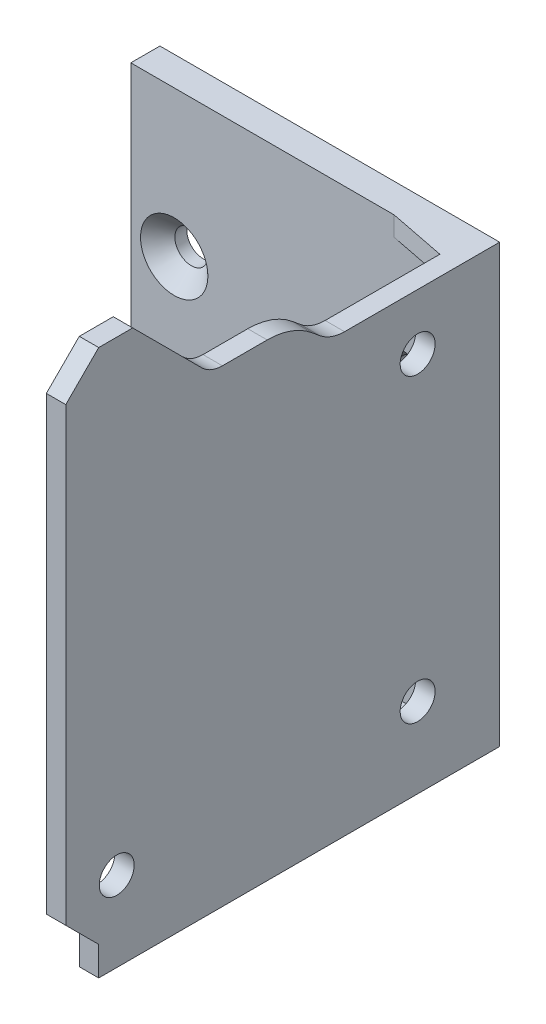
ISO-10303-21;
HEADER;
FILE_DESCRIPTION(('STEP AP214'),'2;1');
FILE_NAME('part.step','',(''),(''),'','','');
FILE_SCHEMA(('AUTOMOTIVE_DESIGN { 1 0 10303 214 1 1 1 1 }'));
ENDSEC;
DATA;
#1=APPLICATION_CONTEXT('core data for automotive mechanical design processes');
#2=APPLICATION_PROTOCOL_DEFINITION('international standard','automotive_design',2000,#1);
#3=PRODUCT_CONTEXT('',#1,'mechanical');
#4=PRODUCT('Part','Part','',(#3));
#5=PRODUCT_RELATED_PRODUCT_CATEGORY('part','',(#4));
#6=PRODUCT_DEFINITION_FORMATION('','',#4);
#7=PRODUCT_DEFINITION_CONTEXT('part definition',#1,'design');
#8=PRODUCT_DEFINITION('design','',#6,#7);
#9=PRODUCT_DEFINITION_SHAPE('','',#8);
#10=(LENGTH_UNIT() NAMED_UNIT(*) SI_UNIT(.MILLI.,.METRE.));
#11=(NAMED_UNIT(*) PLANE_ANGLE_UNIT() SI_UNIT($,.RADIAN.));
#12=(NAMED_UNIT(*) SI_UNIT($,.STERADIAN.) SOLID_ANGLE_UNIT());
#13=UNCERTAINTY_MEASURE_WITH_UNIT(LENGTH_MEASURE(1.E-05),#10,'distance_accuracy_value','');
#14=(GEOMETRIC_REPRESENTATION_CONTEXT(3) GLOBAL_UNCERTAINTY_ASSIGNED_CONTEXT((#13)) GLOBAL_UNIT_ASSIGNED_CONTEXT((#10,
#11,#12)) REPRESENTATION_CONTEXT('',''));
#15=CARTESIAN_POINT('',(0.,0.,0.));
#16=DIRECTION('',(0.,0.,1.));
#17=DIRECTION('',(1.,0.,0.));
#18=AXIS2_PLACEMENT_3D('',#15,#16,#17);
#19=CARTESIAN_POINT('',(-17.6983056030445,250.900701951073,907.075195291621));
#20=DIRECTION('',(0.,0.,-1.));
#21=DIRECTION('',(-1.,0.,0.));
#22=AXIS2_PLACEMENT_3D('',#19,#20,#21);
#23=PLANE('',#22);
#24=DIRECTION('',(1.,0.,0.));
#25=VECTOR('',#24,1.);
#26=CARTESIAN_POINT('',(-17.6983056030445,248.900701951073,907.075195291621));
#27=LINE('',#26,#25);
#28=CARTESIAN_POINT('',(-34.1983056030445,248.900701951073,907.075195291621));
#29=VERTEX_POINT('',#28);
#30=CARTESIAN_POINT('',(-17.6983056030445,248.900701951073,907.075195291621));
#31=VERTEX_POINT('',#30);
#32=EDGE_CURVE('E95',#29,#31,#27,.T.);
#33=ORIENTED_EDGE('',*,*,#32,.F.);
#34=DIRECTION('',(0.,-1.,0.));
#35=VECTOR('',#34,1.);
#36=CARTESIAN_POINT('',(-34.1983056030445,250.900701951073,907.075195291621));
#37=LINE('',#36,#35);
#38=CARTESIAN_POINT('',(-34.1983056030445,250.900701951073,907.075195291621));
#39=VERTEX_POINT('',#38);
#40=EDGE_CURVE('E12',#39,#29,#37,.T.);
#41=ORIENTED_EDGE('',*,*,#40,.F.);
#42=DIRECTION('',(1.,0.,0.));
#43=VECTOR('',#42,1.);
#44=CARTESIAN_POINT('',(-17.6983056030445,250.900701951073,907.075195291621));
#45=LINE('',#44,#43);
#46=CARTESIAN_POINT('',(-17.6983056030445,250.900701951073,907.075195291621));
#47=VERTEX_POINT('',#46);
#48=EDGE_CURVE('E87',#39,#47,#45,.T.);
#49=ORIENTED_EDGE('',*,*,#48,.T.);
#50=DIRECTION('',(0.,-1.,0.));
#51=VECTOR('',#50,1.);
#52=CARTESIAN_POINT('',(-17.6983056030445,250.900701951073,907.075195291621));
#53=LINE('',#52,#51);
#54=EDGE_CURVE('E46',#47,#31,#53,.T.);
#55=ORIENTED_EDGE('',*,*,#54,.T.);
#56=EDGE_LOOP('',(#33,#41,#49,#55));
#57=FACE_BOUND('',#56,.T.);
#58=ADVANCED_FACE('F43',(#57),#23,.T.);
#59=CARTESIAN_POINT('',(-34.1983056030445,250.900701951073,907.075195291621));
#60=DIRECTION('',(-0.757628205299073,0.,0.652686373793191));
#61=DIRECTION('',(0.652686373793191,0.,0.757628205299073));
#62=AXIS2_PLACEMENT_3D('',#59,#60,#61);
#63=PLANE('',#62);
#64=DIRECTION('',(-0.652686373793191,0.,-0.757628205299073));
#65=VECTOR('',#64,1.);
#66=CARTESIAN_POINT('',(-34.1983056030445,248.900701951073,907.075195291621));
#67=LINE('',#66,#65);
#68=CARTESIAN_POINT('',(-17.6983056030445,248.900701951073,926.228139016773));
#69=VERTEX_POINT('',#68);
#70=EDGE_CURVE('E89',#69,#29,#67,.T.);
#71=ORIENTED_EDGE('',*,*,#70,.F.);
#72=DIRECTION('',(0.,-1.,0.));
#73=VECTOR('',#72,1.);
#74=CARTESIAN_POINT('',(-17.6983056030445,250.900701951073,926.228139016773));
#75=LINE('',#74,#73);
#76=CARTESIAN_POINT('',(-17.6983056030445,250.900701951073,926.228139016773));
#77=VERTEX_POINT('',#76);
#78=EDGE_CURVE('E52',#77,#69,#75,.T.);
#79=ORIENTED_EDGE('',*,*,#78,.F.);
#80=DIRECTION('',(-0.652686373793191,0.,-0.757628205299073));
#81=VECTOR('',#80,1.);
#82=CARTESIAN_POINT('',(-34.1983056030445,250.900701951073,907.075195291621));
#83=LINE('',#82,#81);
#84=EDGE_CURVE('E84',#77,#39,#83,.T.);
#85=ORIENTED_EDGE('',*,*,#84,.T.);
#86=ORIENTED_EDGE('',*,*,#40,.T.);
#87=EDGE_LOOP('',(#71,#79,#85,#86));
#88=FACE_BOUND('',#87,.T.);
#89=ADVANCED_FACE('F99',(#88),#63,.T.);
#90=CARTESIAN_POINT('',(-17.6983056030445,250.900701951073,926.228139016773));
#91=DIRECTION('',(1.,0.,0.));
#92=DIRECTION('',(0.,0.,-1.));
#93=AXIS2_PLACEMENT_3D('',#90,#91,#92);
#94=PLANE('',#93);
#95=DIRECTION('',(0.,0.,1.));
#96=VECTOR('',#95,1.);
#97=CARTESIAN_POINT('',(-17.6983056030445,248.900701951073,926.228139016773));
#98=LINE('',#97,#96);
#99=EDGE_CURVE('E82',#31,#69,#98,.T.);
#100=ORIENTED_EDGE('',*,*,#99,.F.);
#101=ORIENTED_EDGE('',*,*,#54,.F.);
#102=DIRECTION('',(0.,0.,1.));
#103=VECTOR('',#102,1.);
#104=CARTESIAN_POINT('',(-17.6983056030445,250.900701951073,926.228139016773));
#105=LINE('',#104,#103);
#106=EDGE_CURVE('E80',#47,#77,#105,.T.);
#107=ORIENTED_EDGE('',*,*,#106,.T.);
#108=ORIENTED_EDGE('',*,*,#78,.T.);
#109=EDGE_LOOP('',(#100,#101,#107,#108));
#110=FACE_BOUND('',#109,.T.);
#111=ADVANCED_FACE('F79',(#110),#94,.T.);
#112=CARTESIAN_POINT('',(0.,250.900701951073,0.));
#113=DIRECTION('',(0.,-1.,0.));
#114=DIRECTION('',(0.,0.,-1.));
#115=AXIS2_PLACEMENT_3D('',#112,#113,#114);
#116=PLANE('',#115);
#117=ORIENTED_EDGE('',*,*,#48,.F.);
#118=ORIENTED_EDGE('',*,*,#84,.F.);
#119=ORIENTED_EDGE('',*,*,#106,.F.);
#120=EDGE_LOOP('',(#117,#118,#119));
#121=FACE_BOUND('',#120,.T.);
#122=ADVANCED_FACE('F86',(#121),#116,.F.);
#123=CARTESIAN_POINT('',(0.,248.900701951073,0.));
#124=DIRECTION('',(0.,-1.,0.));
#125=DIRECTION('',(0.,0.,-1.));
#126=AXIS2_PLACEMENT_3D('',#123,#124,#125);
#127=PLANE('',#126);
#128=ORIENTED_EDGE('',*,*,#32,.T.);
#129=ORIENTED_EDGE('',*,*,#99,.T.);
#130=ORIENTED_EDGE('',*,*,#70,.T.);
#131=EDGE_LOOP('',(#128,#129,#130));
#132=FACE_BOUND('',#131,.T.);
#133=ADVANCED_FACE('F98',(#132),#127,.T.);
#134=CLOSED_SHELL('',(#58,#89,#111,#122,#133));
#135=MANIFOLD_SOLID_BREP('B2',#134);
#136=CARTESIAN_POINT('',(-17.6983056030445,300.150701951073,932.638442054806));
#137=DIRECTION('',(1.,0.,0.));
#138=DIRECTION('',(0.,1.,0.));
#139=AXIS2_PLACEMENT_3D('',#136,#137,#138);
#140=PLANE('',#139);
#141=DIRECTION('',(0.,0.,1.));
#142=VECTOR('',#141,1.);
#143=CARTESIAN_POINT('',(-17.6983056030445,293.900701951073,911.775195291621));
#144=LINE('',#143,#142);
#145=CARTESIAN_POINT('',(-17.6983056030445,293.900701951073,908.234078598039));
#146=VERTEX_POINT('',#145);
#147=CARTESIAN_POINT('',(-17.6983056030445,293.900701951073,920.05258593207));
#148=VERTEX_POINT('',#147);
#149=EDGE_CURVE('E261',#146,#148,#144,.T.);
#150=ORIENTED_EDGE('',*,*,#149,.F.);
#151=DIRECTION('',(0.,1.,0.));
#152=VECTOR('',#151,1.);
#153=CARTESIAN_POINT('',(-17.6983056030445,291.900701951073,908.234078598039));
#154=LINE('',#153,#152);
#155=CARTESIAN_POINT('',(-17.6983056030445,291.900701951073,908.234078598039));
#156=VERTEX_POINT('',#155);
#157=EDGE_CURVE('E501',#156,#146,#154,.T.);
#158=ORIENTED_EDGE('',*,*,#157,.F.);
#159=DIRECTION('',(0.,0.,-1.));
#160=VECTOR('',#159,1.);
#161=CARTESIAN_POINT('',(-17.6983056030445,291.900701951073,907.075195291621));
#162=LINE('',#161,#160);
#163=CARTESIAN_POINT('',(-17.6983056030445,291.900701951073,907.075195291621));
#164=VERTEX_POINT('',#163);
#165=EDGE_CURVE('E456',#156,#164,#162,.T.);
#166=ORIENTED_EDGE('',*,*,#165,.T.);
#167=DIRECTION('',(0.,1.,0.));
#168=VECTOR('',#167,1.);
#169=CARTESIAN_POINT('',(-17.6983056030445,293.900701951073,907.075195291621));
#170=LINE('',#169,#168);
#171=CARTESIAN_POINT('',(-17.6983056030445,248.900701951073,907.075195291621));
#172=VERTEX_POINT('',#171);
#173=EDGE_CURVE('E398',#172,#164,#170,.T.);
#174=ORIENTED_EDGE('',*,*,#173,.F.);
#175=DIRECTION('',(0.,0.,-1.));
#176=VECTOR('',#175,1.);
#177=CARTESIAN_POINT('',(-17.6983056030445,248.900701951073,907.075195291621));
#178=LINE('',#177,#176);
#179=CARTESIAN_POINT('',(-17.6983056030445,248.900701951073,945.381082741926));
#180=VERTEX_POINT('',#179);
#181=EDGE_CURVE('E447',#180,#172,#178,.T.);
#182=ORIENTED_EDGE('',*,*,#181,.F.);
#183=DIRECTION('',(0.,-1.,0.));
#184=VECTOR('',#183,1.);
#185=CARTESIAN_POINT('',(-17.6983056030445,251.900801951073,945.381082741926));
#186=LINE('',#185,#184);
#187=CARTESIAN_POINT('',(-17.6983056030445,251.900701951073,945.381082741926));
#188=VERTEX_POINT('',#187);
#189=EDGE_CURVE('E351',#188,#180,#186,.T.);
#190=ORIENTED_EDGE('',*,*,#189,.F.);
#191=DIRECTION('',(0.,-0.707106781186559,-0.707106781186536));
#192=VECTOR('',#191,1.);
#193=CARTESIAN_POINT('',(-17.6983056030445,255.294814500768,948.775195291621));
#194=LINE('',#193,#192);
#195=CARTESIAN_POINT('',(-17.6983056030445,255.294814500768,948.775195291621));
#196=VERTEX_POINT('',#195);
#197=EDGE_CURVE('E280',#196,#188,#194,.T.);
#198=ORIENTED_EDGE('',*,*,#197,.F.);
#199=DIRECTION('',(0.,-1.,0.));
#200=VECTOR('',#199,1.);
#201=CARTESIAN_POINT('',(-17.6983056030445,301.756589401377,948.775195291621));
#202=LINE('',#201,#200);
#203=CARTESIAN_POINT('',(-17.6983056030445,301.756589401377,948.775195291621));
#204=VERTEX_POINT('',#203);
#205=EDGE_CURVE('E200',#204,#196,#202,.T.);
#206=ORIENTED_EDGE('',*,*,#205,.F.);
#207=DIRECTION('',(0.,-0.707106781186553,0.707106781186542));
#208=VECTOR('',#207,1.);
#209=CARTESIAN_POINT('',(-17.6983056030445,301.756589401377,948.775195291621));
#210=LINE('',#209,#208);
#211=CARTESIAN_POINT('',(-17.6983056030445,305.150701951073,945.381082741926));
#212=VERTEX_POINT('',#211);
#213=EDGE_CURVE('E194',#212,#204,#210,.T.);
#214=ORIENTED_EDGE('',*,*,#213,.F.);
#215=DIRECTION('',(0.,0.,1.));
#216=VECTOR('',#215,1.);
#217=CARTESIAN_POINT('',(-17.6983056030445,305.150701951073,941.881082741926));
#218=LINE('',#217,#216);
#219=CARTESIAN_POINT('',(-17.6983056030445,305.150701951073,941.881082741926));
#220=VERTEX_POINT('',#219);
#221=EDGE_CURVE('E249',#220,#212,#218,.T.);
#222=ORIENTED_EDGE('',*,*,#221,.F.);
#223=DIRECTION('',(0.,0.707106781186553,0.707106781186542));
#224=VECTOR('',#223,1.);
#225=CARTESIAN_POINT('',(-17.6983056030445,305.150701951073,941.881082741926));
#226=LINE('',#225,#224);
#227=CARTESIAN_POINT('',(-17.6983056030445,298.029381607513,934.759762398366));
#228=VERTEX_POINT('',#227);
#229=EDGE_CURVE('E275',#228,#220,#226,.T.);
#230=ORIENTED_EDGE('',*,*,#229,.F.);
#231=CARTESIAN_POINT('',(-17.6983056030445,300.150701951073,932.638442054806));
#232=DIRECTION('',(-1.,0.,0.));
#233=DIRECTION('',(0.,1.,0.));
#234=AXIS2_PLACEMENT_3D('',#231,#232,#233);
#235=CIRCLE('',#234,2.99999999999998);
#236=CARTESIAN_POINT('',(-17.6983056030445,297.150701951073,932.638442054806));
#237=VERTEX_POINT('',#236);
#238=EDGE_CURVE('E272',#237,#228,#235,.T.);
#239=ORIENTED_EDGE('',*,*,#238,.F.);
#240=DIRECTION('',(0.,0.,1.));
#241=VECTOR('',#240,1.);
#242=CARTESIAN_POINT('',(-17.6983056030445,297.150701951073,928.025195291621));
#243=LINE('',#242,#241);
#244=CARTESIAN_POINT('',(-17.6983056030445,297.150701951073,928.025195291621));
#245=VERTEX_POINT('',#244);
#246=EDGE_CURVE('E270',#245,#237,#243,.T.);
#247=ORIENTED_EDGE('',*,*,#246,.F.);
#248=CARTESIAN_POINT('',(-17.6983056030445,289.900701951073,928.025195291621));
#249=DIRECTION('',(1.,0.,0.));
#250=DIRECTION('',(0.,1.,0.));
#251=AXIS2_PLACEMENT_3D('',#248,#249,#250);
#252=CIRCLE('',#251,7.24999999999998);
#253=CARTESIAN_POINT('',(-17.6983056030445,295.468963923492,923.382248101903));
#254=VERTEX_POINT('',#253);
#255=EDGE_CURVE('E268',#254,#245,#252,.T.);
#256=ORIENTED_EDGE('',*,*,#255,.F.);
#257=DIRECTION('',(0.,0.640406508926575,0.768036134126824));
#258=VECTOR('',#257,1.);
#259=CARTESIAN_POINT('',(-17.6983056030445,294.828557414566,922.614211967776));
#260=LINE('',#259,#258);
#261=CARTESIAN_POINT('',(-17.6983056030445,294.828557414566,922.614211967776));
#262=VERTEX_POINT('',#261);
#263=EDGE_CURVE('E266',#262,#254,#260,.T.);
#264=ORIENTED_EDGE('',*,*,#263,.F.);
#265=CARTESIAN_POINT('',(-17.6983056030445,297.900701951073,920.05258593207));
#266=DIRECTION('',(-1.,0.,0.));
#267=DIRECTION('',(0.,1.,0.));
#268=AXIS2_PLACEMENT_3D('',#265,#266,#267);
#269=CIRCLE('',#268,4.00000000000001);
#270=EDGE_CURVE('E263',#148,#262,#269,.T.);
#271=ORIENTED_EDGE('',*,*,#270,.F.);
#272=EDGE_LOOP('',(#150,#158,#166,#174,#182,#190,#198,#206,#214,#222,#230,#239,#247,#256,#264,#271));
#273=FACE_BOUND('',#272,.T.);
#274=CARTESIAN_POINT('',(-17.6983056030445,257.150701951073,943.525195291621));
#275=DIRECTION('',(1.,0.,0.));
#276=DIRECTION('',(0.,1.,0.));
#277=AXIS2_PLACEMENT_3D('',#274,#275,#276);
#278=CIRCLE('',#277,1.79999999999989);
#279=CARTESIAN_POINT('',(-17.6983056030445,258.950701951073,943.525195291621));
#280=VERTEX_POINT('',#279);
#281=EDGE_CURVE('E395',#280,#280,#278,.T.);
#282=ORIENTED_EDGE('',*,*,#281,.T.);
#283=EDGE_LOOP('',(#282));
#284=FACE_BOUND('',#283,.T.);
#285=CARTESIAN_POINT('',(-17.6983056030445,257.150701951073,912.525195291621));
#286=DIRECTION('',(1.,0.,0.));
#287=DIRECTION('',(0.,1.,0.));
#288=AXIS2_PLACEMENT_3D('',#285,#286,#287);
#289=CIRCLE('',#288,1.79999999999989);
#290=CARTESIAN_POINT('',(-17.6983056030445,258.950701951073,912.525195291621));
#291=VERTEX_POINT('',#290);
#292=EDGE_CURVE('E410',#291,#291,#289,.T.);
#293=ORIENTED_EDGE('',*,*,#292,.T.);
#294=EDGE_LOOP('',(#293));
#295=FACE_BOUND('',#294,.T.);
#296=CARTESIAN_POINT('',(-17.6983056030445,288.150701951073,912.525195291621));
#297=DIRECTION('',(1.,0.,0.));
#298=DIRECTION('',(0.,1.,0.));
#299=AXIS2_PLACEMENT_3D('',#296,#297,#298);
#300=CIRCLE('',#299,1.79999999999989);
#301=CARTESIAN_POINT('',(-17.6983056030445,289.950701951073,912.525195291621));
#302=VERTEX_POINT('',#301);
#303=EDGE_CURVE('E416',#302,#302,#300,.T.);
#304=ORIENTED_EDGE('',*,*,#303,.T.);
#305=EDGE_LOOP('',(#304));
#306=FACE_BOUND('',#305,.T.);
#307=ADVANCED_FACE('F141',(#273,#284,#295,#306),#140,.F.);
#308=CARTESIAN_POINT('',(-15.6983056030445,300.150701951073,932.638442054806));
#309=DIRECTION('',(1.,0.,0.));
#310=DIRECTION('',(0.,1.,0.));
#311=AXIS2_PLACEMENT_3D('',#308,#309,#310);
#312=PLANE('',#311);
#313=DIRECTION('',(0.,-1.,0.));
#314=VECTOR('',#313,1.);
#315=CARTESIAN_POINT('',(-15.6983056030445,251.900801951073,945.381082741926));
#316=LINE('',#315,#314);
#317=CARTESIAN_POINT('',(-15.6983056030445,251.900701951073,945.381082741926));
#318=VERTEX_POINT('',#317);
#319=CARTESIAN_POINT('',(-15.6983056030445,248.900701951073,945.381082741926));
#320=VERTEX_POINT('',#319);
#321=EDGE_CURVE('E404',#318,#320,#316,.T.);
#322=ORIENTED_EDGE('',*,*,#321,.T.);
#323=DIRECTION('',(0.,0.,1.));
#324=VECTOR('',#323,1.);
#325=CARTESIAN_POINT('',(-15.6983056030445,248.900701951073,945.381082741926));
#326=LINE('',#325,#324);
#327=CARTESIAN_POINT('',(-15.6983056030445,248.900701951073,904.075195291621));
#328=VERTEX_POINT('',#327);
#329=EDGE_CURVE('E460',#328,#320,#326,.T.);
#330=ORIENTED_EDGE('',*,*,#329,.F.);
#331=DIRECTION('',(0.,1.,0.));
#332=VECTOR('',#331,1.);
#333=CARTESIAN_POINT('',(-15.6983056030445,293.900701951073,904.075195291621));
#334=LINE('',#333,#332);
#335=CARTESIAN_POINT('',(-15.6983056030445,293.900701951073,904.075195291621));
#336=VERTEX_POINT('',#335);
#337=EDGE_CURVE('E208',#328,#336,#334,.T.);
#338=ORIENTED_EDGE('',*,*,#337,.T.);
#339=DIRECTION('',(0.,0.,1.));
#340=VECTOR('',#339,1.);
#341=CARTESIAN_POINT('',(-15.6983056030445,293.900701951073,911.775195291621));
#342=LINE('',#341,#340);
#343=CARTESIAN_POINT('',(-15.6983056030445,293.900701951073,920.05258593207));
#344=VERTEX_POINT('',#343);
#345=EDGE_CURVE('E424',#336,#344,#342,.T.);
#346=ORIENTED_EDGE('',*,*,#345,.T.);
#347=CARTESIAN_POINT('',(-15.6983056030445,297.900701951073,920.05258593207));
#348=DIRECTION('',(-1.,0.,0.));
#349=DIRECTION('',(0.,1.,0.));
#350=AXIS2_PLACEMENT_3D('',#347,#348,#349);
#351=CIRCLE('',#350,4.00000000000001);
#352=CARTESIAN_POINT('',(-15.6983056030445,294.828557414566,922.614211967776));
#353=VERTEX_POINT('',#352);
#354=EDGE_CURVE('E310',#344,#353,#351,.T.);
#355=ORIENTED_EDGE('',*,*,#354,.T.);
#356=DIRECTION('',(0.,0.640406508926575,0.768036134126824));
#357=VECTOR('',#356,1.);
#358=CARTESIAN_POINT('',(-15.6983056030445,294.828557414566,922.614211967776));
#359=LINE('',#358,#357);
#360=CARTESIAN_POINT('',(-15.6983056030445,295.468963923492,923.382248101903));
#361=VERTEX_POINT('',#360);
#362=EDGE_CURVE('E331',#353,#361,#359,.T.);
#363=ORIENTED_EDGE('',*,*,#362,.T.);
#364=CARTESIAN_POINT('',(-15.6983056030445,289.900701951073,928.025195291621));
#365=DIRECTION('',(1.,0.,0.));
#366=DIRECTION('',(0.,1.,0.));
#367=AXIS2_PLACEMENT_3D('',#364,#365,#366);
#368=CIRCLE('',#367,7.24999999999998);
#369=CARTESIAN_POINT('',(-15.6983056030445,297.150701951073,928.025195291621));
#370=VERTEX_POINT('',#369);
#371=EDGE_CURVE('E328',#361,#370,#368,.T.);
#372=ORIENTED_EDGE('',*,*,#371,.T.);
#373=DIRECTION('',(0.,0.,1.));
#374=VECTOR('',#373,1.);
#375=CARTESIAN_POINT('',(-15.6983056030445,297.150701951073,928.025195291621));
#376=LINE('',#375,#374);
#377=CARTESIAN_POINT('',(-15.6983056030445,297.150701951073,932.638442054806));
#378=VERTEX_POINT('',#377);
#379=EDGE_CURVE('E330',#370,#378,#376,.T.);
#380=ORIENTED_EDGE('',*,*,#379,.T.);
#381=CARTESIAN_POINT('',(-15.6983056030445,300.150701951073,932.638442054806));
#382=DIRECTION('',(-1.,0.,0.));
#383=DIRECTION('',(0.,1.,0.));
#384=AXIS2_PLACEMENT_3D('',#381,#382,#383);
#385=CIRCLE('',#384,2.99999999999998);
#386=CARTESIAN_POINT('',(-15.6983056030445,298.029381607513,934.759762398366));
#387=VERTEX_POINT('',#386);
#388=EDGE_CURVE('E333',#378,#387,#385,.T.);
#389=ORIENTED_EDGE('',*,*,#388,.T.);
#390=DIRECTION('',(0.,0.707106781186542,0.707106781186553));
#391=VECTOR('',#390,1.);
#392=CARTESIAN_POINT('',(-15.6983056030445,298.029381607513,934.759762398366));
#393=LINE('',#392,#391);
#394=CARTESIAN_POINT('',(-15.6983056030445,305.150701951073,941.881082741926));
#395=VERTEX_POINT('',#394);
#396=EDGE_CURVE('E241',#387,#395,#393,.T.);
#397=ORIENTED_EDGE('',*,*,#396,.T.);
#398=DIRECTION('',(0.,0.,1.));
#399=VECTOR('',#398,1.);
#400=CARTESIAN_POINT('',(-15.6983056030445,305.150701951073,941.881082741926));
#401=LINE('',#400,#399);
#402=CARTESIAN_POINT('',(-15.6983056030445,305.150701951073,945.381082741926));
#403=VERTEX_POINT('',#402);
#404=EDGE_CURVE('E233',#395,#403,#401,.T.);
#405=ORIENTED_EDGE('',*,*,#404,.T.);
#406=DIRECTION('',(0.,-0.707106781186553,0.707106781186542));
#407=VECTOR('',#406,1.);
#408=CARTESIAN_POINT('',(-15.6983056030445,301.756589401377,948.775195291621));
#409=LINE('',#408,#407);
#410=CARTESIAN_POINT('',(-15.6983056030445,301.756589401377,948.775195291621));
#411=VERTEX_POINT('',#410);
#412=EDGE_CURVE('E239',#403,#411,#409,.T.);
#413=ORIENTED_EDGE('',*,*,#412,.T.);
#414=DIRECTION('',(0.,-1.,0.));
#415=VECTOR('',#414,1.);
#416=CARTESIAN_POINT('',(-15.6983056030445,301.756589401377,948.775195291621));
#417=LINE('',#416,#415);
#418=CARTESIAN_POINT('',(-15.6983056030445,255.294814500768,948.775195291621));
#419=VERTEX_POINT('',#418);
#420=EDGE_CURVE('E158',#411,#419,#417,.T.);
#421=ORIENTED_EDGE('',*,*,#420,.T.);
#422=DIRECTION('',(0.,-0.707106781186559,-0.707106781186536));
#423=VECTOR('',#422,1.);
#424=CARTESIAN_POINT('',(-15.6983056030445,255.294814500768,948.775195291621));
#425=LINE('',#424,#423);
#426=EDGE_CURVE('E255',#419,#318,#425,.T.);
#427=ORIENTED_EDGE('',*,*,#426,.T.);
#428=EDGE_LOOP('',(#322,#330,#338,#346,#355,#363,#372,#380,#389,#397,#405,#413,#421,#427));
#429=FACE_BOUND('',#428,.T.);
#430=CARTESIAN_POINT('',(-15.6983056030445,257.150701951073,912.525195291621));
#431=DIRECTION('',(1.,0.,0.));
#432=DIRECTION('',(0.,1.,0.));
#433=AXIS2_PLACEMENT_3D('',#430,#431,#432);
#434=CIRCLE('',#433,1.79999999999989);
#435=CARTESIAN_POINT('',(-15.6983056030445,258.950701951073,912.525195291621));
#436=VERTEX_POINT('',#435);
#437=EDGE_CURVE('E413',#436,#436,#434,.T.);
#438=ORIENTED_EDGE('',*,*,#437,.F.);
#439=EDGE_LOOP('',(#438));
#440=FACE_BOUND('',#439,.T.);
#441=CARTESIAN_POINT('',(-15.6983056030445,288.150701951073,912.525195291621));
#442=DIRECTION('',(1.,0.,0.));
#443=DIRECTION('',(0.,1.,0.));
#444=AXIS2_PLACEMENT_3D('',#441,#442,#443);
#445=CIRCLE('',#444,1.79999999999989);
#446=CARTESIAN_POINT('',(-15.6983056030445,289.950701951073,912.525195291621));
#447=VERTEX_POINT('',#446);
#448=EDGE_CURVE('E264',#447,#447,#445,.T.);
#449=ORIENTED_EDGE('',*,*,#448,.F.);
#450=EDGE_LOOP('',(#449));
#451=FACE_BOUND('',#450,.T.);
#452=CARTESIAN_POINT('',(-15.6983056030445,257.150701951073,943.525195291621));
#453=DIRECTION('',(1.,0.,0.));
#454=DIRECTION('',(0.,1.,0.));
#455=AXIS2_PLACEMENT_3D('',#452,#453,#454);
#456=CIRCLE('',#455,1.79999999999989);
#457=CARTESIAN_POINT('',(-15.6983056030445,258.950701951073,943.525195291621));
#458=VERTEX_POINT('',#457);
#459=EDGE_CURVE('E407',#458,#458,#456,.T.);
#460=ORIENTED_EDGE('',*,*,#459,.F.);
#461=EDGE_LOOP('',(#460));
#462=FACE_BOUND('',#461,.T.);
#463=ADVANCED_FACE('F236',(#429,#440,#451,#462),#312,.T.);
#464=CARTESIAN_POINT('',(-15.6983056030445,293.900701951073,904.075195291621));
#465=DIRECTION('',(0.,0.,1.));
#466=DIRECTION('',(1.,0.,0.));
#467=AXIS2_PLACEMENT_3D('',#464,#465,#466);
#468=PLANE('',#467);
#469=CARTESIAN_POINT('',(-46.2280145570519,278.845328546138,904.075195291621));
#470=DIRECTION('',(0.,0.,1.));
#471=DIRECTION('',(0.,-1.,0.));
#472=AXIS2_PLACEMENT_3D('',#469,#470,#471);
#473=CIRCLE('',#472,1.69999999999999);
#474=CARTESIAN_POINT('',(-46.2280145570519,277.145328546138,904.075195291621));
#475=VERTEX_POINT('',#474);
#476=EDGE_CURVE('E492',#475,#475,#473,.T.);
#477=ORIENTED_EDGE('',*,*,#476,.T.);
#478=EDGE_LOOP('',(#477));
#479=FACE_BOUND('',#478,.T.);
#480=CARTESIAN_POINT('',(-23.2280145570519,278.845328546138,904.075195291621));
#481=DIRECTION('',(0.,0.,1.));
#482=DIRECTION('',(0.,-1.,0.));
#483=AXIS2_PLACEMENT_3D('',#480,#481,#482);
#484=CIRCLE('',#483,1.69999999999999);
#485=CARTESIAN_POINT('',(-23.2280145570519,277.145328546138,904.075195291621));
#486=VERTEX_POINT('',#485);
#487=EDGE_CURVE('E483',#486,#486,#484,.T.);
#488=ORIENTED_EDGE('',*,*,#487,.T.);
#489=EDGE_LOOP('',(#488));
#490=FACE_BOUND('',#489,.T.);
#491=CARTESIAN_POINT('',(-46.2280145570519,256.845328546138,904.075195291621));
#492=DIRECTION('',(0.,0.,1.));
#493=DIRECTION('',(0.,-1.,0.));
#494=AXIS2_PLACEMENT_3D('',#491,#492,#493);
#495=CIRCLE('',#494,1.69999999999999);
#496=CARTESIAN_POINT('',(-46.2280145570519,255.145328546138,904.075195291621));
#497=VERTEX_POINT('',#496);
#498=EDGE_CURVE('E474',#497,#497,#495,.T.);
#499=ORIENTED_EDGE('',*,*,#498,.T.);
#500=EDGE_LOOP('',(#499));
#501=FACE_BOUND('',#500,.T.);
#502=CARTESIAN_POINT('',(-23.2280145570519,256.845328546138,904.075195291621));
#503=DIRECTION('',(0.,0.,1.));
#504=DIRECTION('',(0.,-1.,0.));
#505=AXIS2_PLACEMENT_3D('',#502,#503,#504);
#506=CIRCLE('',#505,1.69999999999999);
#507=CARTESIAN_POINT('',(-23.2280145570519,255.145328546138,904.075195291621));
#508=VERTEX_POINT('',#507);
#509=EDGE_CURVE('E465',#508,#508,#506,.T.);
#510=ORIENTED_EDGE('',*,*,#509,.T.);
#511=EDGE_LOOP('',(#510));
#512=FACE_BOUND('',#511,.T.);
#513=DIRECTION('',(-1.,0.,0.));
#514=VECTOR('',#513,1.);
#515=CARTESIAN_POINT('',(-15.6983056030445,293.900701951073,904.075195291621));
#516=LINE('',#515,#514);
#517=CARTESIAN_POINT('',(-50.6983056030445,293.900701951073,904.075195291621));
#518=VERTEX_POINT('',#517);
#519=EDGE_CURVE('E41',#336,#518,#516,.T.);
#520=ORIENTED_EDGE('',*,*,#519,.F.);
#521=ORIENTED_EDGE('',*,*,#337,.F.);
#522=DIRECTION('',(1.,0.,0.));
#523=VECTOR('',#522,1.);
#524=CARTESIAN_POINT('',(-15.6983056030445,248.900701951073,904.075195291621));
#525=LINE('',#524,#523);
#526=CARTESIAN_POINT('',(-50.6983056030445,248.900701951073,904.075195291621));
#527=VERTEX_POINT('',#526);
#528=EDGE_CURVE('E430',#527,#328,#525,.T.);
#529=ORIENTED_EDGE('',*,*,#528,.F.);
#530=DIRECTION('',(0.,-1.,0.));
#531=VECTOR('',#530,1.);
#532=CARTESIAN_POINT('',(-50.6983056030445,293.900701951073,904.075195291621));
#533=LINE('',#532,#531);
#534=EDGE_CURVE('E385',#518,#527,#533,.T.);
#535=ORIENTED_EDGE('',*,*,#534,.F.);
#536=EDGE_LOOP('',(#520,#521,#529,#535));
#537=FACE_BOUND('',#536,.T.);
#538=ADVANCED_FACE('F143',(#479,#490,#501,#512,#537),#468,.F.);
#539=CARTESIAN_POINT('',(-15.6983056030445,293.900701951073,911.775195291621));
#540=DIRECTION('',(0.,-1.,0.));
#541=DIRECTION('',(1.,0.,0.));
#542=AXIS2_PLACEMENT_3D('',#539,#540,#541);
#543=PLANE('',#542);
#544=DIRECTION('',(0.981118866989631,0.,0.19340571045598));
#545=VECTOR('',#544,1.);
#546=CARTESIAN_POINT('',(-17.6983056030445,293.900701951073,908.234078598039));
#547=LINE('',#546,#545);
#548=CARTESIAN_POINT('',(-23.5771510305431,293.900701951073,907.075195291621));
#549=VERTEX_POINT('',#548);
#550=EDGE_CURVE('E506',#549,#146,#547,.T.);
#551=ORIENTED_EDGE('',*,*,#550,.T.);
#552=ORIENTED_EDGE('',*,*,#149,.T.);
#553=DIRECTION('',(-1.,0.,0.));
#554=VECTOR('',#553,1.);
#555=CARTESIAN_POINT('',(-15.6983056030445,293.900701951073,920.05258593207));
#556=LINE('',#555,#554);
#557=EDGE_CURVE('E150',#344,#148,#556,.T.);
#558=ORIENTED_EDGE('',*,*,#557,.F.);
#559=ORIENTED_EDGE('',*,*,#345,.F.);
#560=ORIENTED_EDGE('',*,*,#519,.T.);
#561=DIRECTION('',(0.,0.,-1.));
#562=VECTOR('',#561,1.);
#563=CARTESIAN_POINT('',(-50.6983056030445,293.900701951073,907.075195291621));
#564=LINE('',#563,#562);
#565=CARTESIAN_POINT('',(-50.6983056030445,293.900701951073,907.075195291621));
#566=VERTEX_POINT('',#565);
#567=EDGE_CURVE('E378',#566,#518,#564,.T.);
#568=ORIENTED_EDGE('',*,*,#567,.F.);
#569=DIRECTION('',(1.,0.,0.));
#570=VECTOR('',#569,1.);
#571=CARTESIAN_POINT('',(-50.6983056030445,293.900701951073,907.075195291621));
#572=LINE('',#571,#570);
#573=EDGE_CURVE('E384',#566,#549,#572,.T.);
#574=ORIENTED_EDGE('',*,*,#573,.T.);
#575=EDGE_LOOP('',(#551,#552,#558,#559,#560,#568,#574));
#576=FACE_BOUND('',#575,.T.);
#577=ADVANCED_FACE('F397',(#576),#543,.F.);
#578=CARTESIAN_POINT('',(-15.6983056030445,297.900701951073,920.05258593207));
#579=DIRECTION('',(-1.,0.,0.));
#580=DIRECTION('',(0.,-1.,0.));
#581=AXIS2_PLACEMENT_3D('',#578,#579,#580);
#582=CYLINDRICAL_SURFACE('',#581,4.00000000000001);
#583=ORIENTED_EDGE('',*,*,#270,.T.);
#584=DIRECTION('',(-1.,0.,0.));
#585=VECTOR('',#584,1.);
#586=CARTESIAN_POINT('',(-15.6983056030445,294.828557414566,922.614211967776));
#587=LINE('',#586,#585);
#588=EDGE_CURVE('E301',#353,#262,#587,.T.);
#589=ORIENTED_EDGE('',*,*,#588,.F.);
#590=ORIENTED_EDGE('',*,*,#354,.F.);
#591=ORIENTED_EDGE('',*,*,#557,.T.);
#592=EDGE_LOOP('',(#583,#589,#590,#591));
#593=FACE_BOUND('',#592,.T.);
#594=ADVANCED_FACE('F308',(#593),#582,.F.);
#595=CARTESIAN_POINT('',(-15.6983056030445,294.828557414566,922.614211967776));
#596=DIRECTION('',(0.,-0.768036134126824,0.640406508926575));
#597=DIRECTION('',(0.,-0.640406508926575,-0.768036134126824));
#598=AXIS2_PLACEMENT_3D('',#595,#596,#597);
#599=PLANE('',#598);
#600=ORIENTED_EDGE('',*,*,#263,.T.);
#601=DIRECTION('',(-1.,0.,0.));
#602=VECTOR('',#601,1.);
#603=CARTESIAN_POINT('',(-15.6983056030445,295.468963923492,923.382248101903));
#604=LINE('',#603,#602);
#605=EDGE_CURVE('E298',#361,#254,#604,.T.);
#606=ORIENTED_EDGE('',*,*,#605,.F.);
#607=ORIENTED_EDGE('',*,*,#362,.F.);
#608=ORIENTED_EDGE('',*,*,#588,.T.);
#609=EDGE_LOOP('',(#600,#606,#607,#608));
#610=FACE_BOUND('',#609,.T.);
#611=ADVANCED_FACE('F322',(#610),#599,.F.);
#612=CARTESIAN_POINT('',(-15.6983056030445,289.900701951073,928.025195291621));
#613=DIRECTION('',(-1.,0.,0.));
#614=DIRECTION('',(0.,-1.,0.));
#615=AXIS2_PLACEMENT_3D('',#612,#613,#614);
#616=CYLINDRICAL_SURFACE('',#615,7.24999999999998);
#617=ORIENTED_EDGE('',*,*,#255,.T.);
#618=DIRECTION('',(-1.,0.,0.));
#619=VECTOR('',#618,1.);
#620=CARTESIAN_POINT('',(-15.6983056030445,297.150701951073,928.025195291621));
#621=LINE('',#620,#619);
#622=EDGE_CURVE('E295',#370,#245,#621,.T.);
#623=ORIENTED_EDGE('',*,*,#622,.F.);
#624=ORIENTED_EDGE('',*,*,#371,.F.);
#625=ORIENTED_EDGE('',*,*,#605,.T.);
#626=EDGE_LOOP('',(#617,#623,#624,#625));
#627=FACE_BOUND('',#626,.T.);
#628=ADVANCED_FACE('F326',(#627),#616,.T.);
#629=CARTESIAN_POINT('',(-15.6983056030445,297.150701951073,928.025195291621));
#630=DIRECTION('',(0.,-1.,0.));
#631=DIRECTION('',(1.,0.,0.));
#632=AXIS2_PLACEMENT_3D('',#629,#630,#631);
#633=PLANE('',#632);
#634=ORIENTED_EDGE('',*,*,#246,.T.);
#635=DIRECTION('',(-1.,0.,0.));
#636=VECTOR('',#635,1.);
#637=CARTESIAN_POINT('',(-15.6983056030445,297.150701951073,932.638442054806));
#638=LINE('',#637,#636);
#639=EDGE_CURVE('E292',#378,#237,#638,.T.);
#640=ORIENTED_EDGE('',*,*,#639,.F.);
#641=ORIENTED_EDGE('',*,*,#379,.F.);
#642=ORIENTED_EDGE('',*,*,#622,.T.);
#643=EDGE_LOOP('',(#634,#640,#641,#642));
#644=FACE_BOUND('',#643,.T.);
#645=ADVANCED_FACE('F554',(#644),#633,.F.);
#646=CARTESIAN_POINT('',(-15.6983056030445,300.150701951073,932.638442054806));
#647=DIRECTION('',(-1.,0.,0.));
#648=DIRECTION('',(0.,-1.,0.));
#649=AXIS2_PLACEMENT_3D('',#646,#647,#648);
#650=CYLINDRICAL_SURFACE('',#649,2.99999999999998);
#651=ORIENTED_EDGE('',*,*,#238,.T.);
#652=DIRECTION('',(-1.,0.,0.));
#653=VECTOR('',#652,1.);
#654=CARTESIAN_POINT('',(-15.6983056030445,298.029381607513,934.759762398366));
#655=LINE('',#654,#653);
#656=EDGE_CURVE('E289',#387,#228,#655,.T.);
#657=ORIENTED_EDGE('',*,*,#656,.F.);
#658=ORIENTED_EDGE('',*,*,#388,.F.);
#659=ORIENTED_EDGE('',*,*,#639,.T.);
#660=EDGE_LOOP('',(#651,#657,#658,#659));
#661=FACE_BOUND('',#660,.T.);
#662=ADVANCED_FACE('F342',(#661),#650,.F.);
#663=CARTESIAN_POINT('',(-15.6983056030445,305.150701951073,941.881082741926));
#664=DIRECTION('',(0.,-0.707106781186542,0.707106781186553));
#665=DIRECTION('',(0.,-0.707106781186553,-0.707106781186542));
#666=AXIS2_PLACEMENT_3D('',#663,#664,#665);
#667=PLANE('',#666);
#668=ORIENTED_EDGE('',*,*,#229,.T.);
#669=DIRECTION('',(-1.,0.,0.));
#670=VECTOR('',#669,1.);
#671=CARTESIAN_POINT('',(-15.6983056030445,305.150701951073,941.881082741926));
#672=LINE('',#671,#670);
#673=EDGE_CURVE('E250',#395,#220,#672,.T.);
#674=ORIENTED_EDGE('',*,*,#673,.F.);
#675=ORIENTED_EDGE('',*,*,#396,.F.);
#676=ORIENTED_EDGE('',*,*,#656,.T.);
#677=EDGE_LOOP('',(#668,#674,#675,#676));
#678=FACE_BOUND('',#677,.T.);
#679=ADVANCED_FACE('F345',(#678),#667,.F.);
#680=CARTESIAN_POINT('',(-15.6983056030445,305.150701951073,941.881082741926));
#681=DIRECTION('',(0.,-1.,0.));
#682=DIRECTION('',(1.,0.,0.));
#683=AXIS2_PLACEMENT_3D('',#680,#681,#682);
#684=PLANE('',#683);
#685=ORIENTED_EDGE('',*,*,#221,.T.);
#686=DIRECTION('',(-1.,0.,0.));
#687=VECTOR('',#686,1.);
#688=CARTESIAN_POINT('',(-15.6983056030445,305.150701951073,945.381082741926));
#689=LINE('',#688,#687);
#690=EDGE_CURVE('E246',#403,#212,#689,.T.);
#691=ORIENTED_EDGE('',*,*,#690,.F.);
#692=ORIENTED_EDGE('',*,*,#404,.F.);
#693=ORIENTED_EDGE('',*,*,#673,.T.);
#694=EDGE_LOOP('',(#685,#691,#692,#693));
#695=FACE_BOUND('',#694,.T.);
#696=ADVANCED_FACE('F247',(#695),#684,.F.);
#697=CARTESIAN_POINT('',(-15.6983056030445,301.756589401377,948.775195291621));
#698=DIRECTION('',(0.,-0.707106781186542,-0.707106781186553));
#699=DIRECTION('',(0.,0.707106781186553,-0.707106781186542));
#700=AXIS2_PLACEMENT_3D('',#697,#698,#699);
#701=PLANE('',#700);
#702=ORIENTED_EDGE('',*,*,#213,.T.);
#703=DIRECTION('',(-1.,0.,0.));
#704=VECTOR('',#703,1.);
#705=CARTESIAN_POINT('',(-15.6983056030445,301.756589401377,948.775195291621));
#706=LINE('',#705,#704);
#707=EDGE_CURVE('E251',#411,#204,#706,.T.);
#708=ORIENTED_EDGE('',*,*,#707,.F.);
#709=ORIENTED_EDGE('',*,*,#412,.F.);
#710=ORIENTED_EDGE('',*,*,#690,.T.);
#711=EDGE_LOOP('',(#702,#708,#709,#710));
#712=FACE_BOUND('',#711,.T.);
#713=ADVANCED_FACE('F253',(#712),#701,.F.);
#714=CARTESIAN_POINT('',(-15.6983056030445,301.756589401377,948.775195291621));
#715=DIRECTION('',(0.,0.,-1.));
#716=DIRECTION('',(-1.,0.,0.));
#717=AXIS2_PLACEMENT_3D('',#714,#715,#716);
#718=PLANE('',#717);
#719=ORIENTED_EDGE('',*,*,#205,.T.);
#720=DIRECTION('',(-1.,0.,0.));
#721=VECTOR('',#720,1.);
#722=CARTESIAN_POINT('',(-15.6983056030445,255.294814500768,948.775195291621));
#723=LINE('',#722,#721);
#724=EDGE_CURVE('E285',#419,#196,#723,.T.);
#725=ORIENTED_EDGE('',*,*,#724,.F.);
#726=ORIENTED_EDGE('',*,*,#420,.F.);
#727=ORIENTED_EDGE('',*,*,#707,.T.);
#728=EDGE_LOOP('',(#719,#725,#726,#727));
#729=FACE_BOUND('',#728,.T.);
#730=ADVANCED_FACE('F543',(#729),#718,.F.);
#731=CARTESIAN_POINT('',(-15.6983056030445,255.294814500768,948.775195291621));
#732=DIRECTION('',(0.,0.707106781186536,-0.707106781186559));
#733=DIRECTION('',(0.,0.707106781186559,0.707106781186536));
#734=AXIS2_PLACEMENT_3D('',#731,#732,#733);
#735=PLANE('',#734);
#736=ORIENTED_EDGE('',*,*,#197,.T.);
#737=DIRECTION('',(-1.,0.,0.));
#738=VECTOR('',#737,1.);
#739=CARTESIAN_POINT('',(-15.6983056030445,251.900701951073,945.381082741926));
#740=LINE('',#739,#738);
#741=EDGE_CURVE('E260',#318,#188,#740,.T.);
#742=ORIENTED_EDGE('',*,*,#741,.F.);
#743=ORIENTED_EDGE('',*,*,#426,.F.);
#744=ORIENTED_EDGE('',*,*,#724,.T.);
#745=EDGE_LOOP('',(#736,#742,#743,#744));
#746=FACE_BOUND('',#745,.T.);
#747=ADVANCED_FACE('F354',(#746),#735,.F.);
#748=CARTESIAN_POINT('',(-15.6983056030445,288.150701951073,912.525195291621));
#749=DIRECTION('',(-1.,0.,0.));
#750=DIRECTION('',(0.,-1.,0.));
#751=AXIS2_PLACEMENT_3D('',#748,#749,#750);
#752=CYLINDRICAL_SURFACE('',#751,1.79999999999989);
#753=ORIENTED_EDGE('',*,*,#448,.T.);
#754=EDGE_LOOP('',(#753));
#755=FACE_BOUND('',#754,.T.);
#756=ORIENTED_EDGE('',*,*,#303,.F.);
#757=EDGE_LOOP('',(#756));
#758=FACE_BOUND('',#757,.T.);
#759=ADVANCED_FACE('F542',(#755,#758),#752,.F.);
#760=CARTESIAN_POINT('',(-15.6983056030445,257.150701951073,912.525195291621));
#761=DIRECTION('',(-1.,0.,0.));
#762=DIRECTION('',(0.,-1.,0.));
#763=AXIS2_PLACEMENT_3D('',#760,#761,#762);
#764=CYLINDRICAL_SURFACE('',#763,1.79999999999989);
#765=ORIENTED_EDGE('',*,*,#437,.T.);
#766=EDGE_LOOP('',(#765));
#767=FACE_BOUND('',#766,.T.);
#768=ORIENTED_EDGE('',*,*,#292,.F.);
#769=EDGE_LOOP('',(#768));
#770=FACE_BOUND('',#769,.T.);
#771=ADVANCED_FACE('F600',(#767,#770),#764,.F.);
#772=CARTESIAN_POINT('',(-15.6983056030445,257.150701951073,943.525195291621));
#773=DIRECTION('',(-1.,0.,0.));
#774=DIRECTION('',(0.,-1.,0.));
#775=AXIS2_PLACEMENT_3D('',#772,#773,#774);
#776=CYLINDRICAL_SURFACE('',#775,1.79999999999989);
#777=ORIENTED_EDGE('',*,*,#459,.T.);
#778=EDGE_LOOP('',(#777));
#779=FACE_BOUND('',#778,.T.);
#780=ORIENTED_EDGE('',*,*,#281,.F.);
#781=EDGE_LOOP('',(#780));
#782=FACE_BOUND('',#781,.T.);
#783=ADVANCED_FACE('F592',(#779,#782),#776,.F.);
#784=CARTESIAN_POINT('',(-50.6983056030445,293.900701951073,907.075195291621));
#785=DIRECTION('',(0.,0.,-1.));
#786=DIRECTION('',(-1.,0.,0.));
#787=AXIS2_PLACEMENT_3D('',#784,#785,#786);
#788=PLANE('',#787);
#789=CARTESIAN_POINT('',(-46.2280145570519,278.845328546138,907.075195291621));
#790=DIRECTION('',(0.,0.,1.));
#791=DIRECTION('',(0.,-1.,0.));
#792=AXIS2_PLACEMENT_3D('',#789,#790,#791);
#793=CIRCLE('',#792,3.47);
#794=CARTESIAN_POINT('',(-46.2280145570519,275.375328546138,907.075195291621));
#795=VERTEX_POINT('',#794);
#796=EDGE_CURVE('E498',#795,#795,#793,.T.);
#797=ORIENTED_EDGE('',*,*,#796,.F.);
#798=EDGE_LOOP('',(#797));
#799=FACE_BOUND('',#798,.T.);
#800=CARTESIAN_POINT('',(-23.2280145570519,278.845328546138,907.075195291621));
#801=DIRECTION('',(0.,0.,1.));
#802=DIRECTION('',(0.,-1.,0.));
#803=AXIS2_PLACEMENT_3D('',#800,#801,#802);
#804=CIRCLE('',#803,3.47);
#805=CARTESIAN_POINT('',(-23.2280145570519,275.375328546138,907.075195291621));
#806=VERTEX_POINT('',#805);
#807=EDGE_CURVE('E489',#806,#806,#804,.T.);
#808=ORIENTED_EDGE('',*,*,#807,.F.);
#809=EDGE_LOOP('',(#808));
#810=FACE_BOUND('',#809,.T.);
#811=CARTESIAN_POINT('',(-46.2280145570519,256.845328546138,907.075195291621));
#812=DIRECTION('',(0.,0.,1.));
#813=DIRECTION('',(0.,-1.,0.));
#814=AXIS2_PLACEMENT_3D('',#811,#812,#813);
#815=CIRCLE('',#814,3.47);
#816=CARTESIAN_POINT('',(-46.2280145570519,253.375328546138,907.075195291621));
#817=VERTEX_POINT('',#816);
#818=EDGE_CURVE('E480',#817,#817,#815,.T.);
#819=ORIENTED_EDGE('',*,*,#818,.F.);
#820=EDGE_LOOP('',(#819));
#821=FACE_BOUND('',#820,.T.);
#822=CARTESIAN_POINT('',(-23.2280145570519,256.845328546138,907.075195291621));
#823=DIRECTION('',(0.,0.,1.));
#824=DIRECTION('',(0.,-1.,0.));
#825=AXIS2_PLACEMENT_3D('',#822,#823,#824);
#826=CIRCLE('',#825,3.47);
#827=CARTESIAN_POINT('',(-23.2280145570519,253.375328546138,907.075195291621));
#828=VERTEX_POINT('',#827);
#829=EDGE_CURVE('E471',#828,#828,#826,.T.);
#830=ORIENTED_EDGE('',*,*,#829,.F.);
#831=EDGE_LOOP('',(#830));
#832=FACE_BOUND('',#831,.T.);
#833=DIRECTION('',(-1.,0.,0.));
#834=VECTOR('',#833,1.);
#835=CARTESIAN_POINT('',(-23.5771510305431,291.900701951073,907.075195291621));
#836=LINE('',#835,#834);
#837=CARTESIAN_POINT('',(-23.5771510305431,291.900701951073,907.075195291621));
#838=VERTEX_POINT('',#837);
#839=EDGE_CURVE('E510',#164,#838,#836,.T.);
#840=ORIENTED_EDGE('',*,*,#839,.T.);
#841=DIRECTION('',(0.,1.,0.));
#842=VECTOR('',#841,1.);
#843=CARTESIAN_POINT('',(-23.5771510305431,291.900701951073,907.075195291621));
#844=LINE('',#843,#842);
#845=EDGE_CURVE('E393',#838,#549,#844,.T.);
#846=ORIENTED_EDGE('',*,*,#845,.T.);
#847=ORIENTED_EDGE('',*,*,#573,.F.);
#848=DIRECTION('',(0.,1.,0.));
#849=VECTOR('',#848,1.);
#850=CARTESIAN_POINT('',(-50.6983056030445,251.900701951073,907.075195291621));
#851=LINE('',#850,#849);
#852=CARTESIAN_POINT('',(-50.6983056030445,248.900701951073,907.075195291621));
#853=VERTEX_POINT('',#852);
#854=EDGE_CURVE('E374',#853,#566,#851,.T.);
#855=ORIENTED_EDGE('',*,*,#854,.F.);
#856=DIRECTION('',(-1.,0.,0.));
#857=VECTOR('',#856,1.);
#858=CARTESIAN_POINT('',(-50.6983056030445,248.900701951073,907.075195291621));
#859=LINE('',#858,#857);
#860=EDGE_CURVE('E450',#172,#853,#859,.T.);
#861=ORIENTED_EDGE('',*,*,#860,.F.);
#862=ORIENTED_EDGE('',*,*,#173,.T.);
#863=EDGE_LOOP('',(#840,#846,#847,#855,#861,#862));
#864=FACE_BOUND('',#863,.T.);
#865=ADVANCED_FACE('F390',(#799,#810,#821,#832,#864),#788,.F.);
#866=CARTESIAN_POINT('',(-50.6983056030444,0.,0.));
#867=DIRECTION('',(-1.,0.,0.));
#868=DIRECTION('',(0.,-1.,0.));
#869=AXIS2_PLACEMENT_3D('',#866,#867,#868);
#870=PLANE('',#869);
#871=ORIENTED_EDGE('',*,*,#534,.T.);
#872=DIRECTION('',(0.,0.,-1.));
#873=VECTOR('',#872,1.);
#874=CARTESIAN_POINT('',(-50.6983056030445,248.900701951073,904.075195291621));
#875=LINE('',#874,#873);
#876=EDGE_CURVE('E380',#853,#527,#875,.T.);
#877=ORIENTED_EDGE('',*,*,#876,.F.);
#878=ORIENTED_EDGE('',*,*,#854,.T.);
#879=ORIENTED_EDGE('',*,*,#567,.T.);
#880=EDGE_LOOP('',(#871,#877,#878,#879));
#881=FACE_BOUND('',#880,.T.);
#882=ADVANCED_FACE('F377',(#881),#870,.T.);
#883=CARTESIAN_POINT('',(-17.6983056030445,251.900801951073,945.381082741926));
#884=DIRECTION('',(0.,0.,1.));
#885=DIRECTION('',(1.,0.,0.));
#886=AXIS2_PLACEMENT_3D('',#883,#884,#885);
#887=PLANE('',#886);
#888=ORIENTED_EDGE('',*,*,#741,.T.);
#889=ORIENTED_EDGE('',*,*,#189,.T.);
#890=DIRECTION('',(-1.,0.,0.));
#891=VECTOR('',#890,1.);
#892=CARTESIAN_POINT('',(-17.6983056030445,248.900701951073,945.381082741926));
#893=LINE('',#892,#891);
#894=EDGE_CURVE('E452',#320,#180,#893,.T.);
#895=ORIENTED_EDGE('',*,*,#894,.F.);
#896=ORIENTED_EDGE('',*,*,#321,.F.);
#897=EDGE_LOOP('',(#888,#889,#895,#896));
#898=FACE_BOUND('',#897,.T.);
#899=ADVANCED_FACE('F459',(#898),#887,.T.);
#900=CARTESIAN_POINT('',(0.,248.900701951073,0.));
#901=DIRECTION('',(0.,1.,0.));
#902=DIRECTION('',(0.,0.,1.));
#903=AXIS2_PLACEMENT_3D('',#900,#901,#902);
#904=PLANE('',#903);
#905=ORIENTED_EDGE('',*,*,#329,.T.);
#906=ORIENTED_EDGE('',*,*,#894,.T.);
#907=ORIENTED_EDGE('',*,*,#181,.T.);
#908=ORIENTED_EDGE('',*,*,#860,.T.);
#909=ORIENTED_EDGE('',*,*,#876,.T.);
#910=ORIENTED_EDGE('',*,*,#528,.T.);
#911=EDGE_LOOP('',(#905,#906,#907,#908,#909,#910));
#912=FACE_BOUND('',#911,.T.);
#913=ADVANCED_FACE('F449',(#912),#904,.F.);
#914=CARTESIAN_POINT('',(-23.2280145570519,256.845328546138,907.075195291621));
#915=DIRECTION('',(0.,0.,1.));
#916=DIRECTION('',(0.,-1.,0.));
#917=AXIS2_PLACEMENT_3D('',#914,#915,#916);
#918=CYLINDRICAL_SURFACE('',#917,1.69999999999999);
#919=ORIENTED_EDGE('',*,*,#509,.F.);
#920=EDGE_LOOP('',(#919));
#921=FACE_BOUND('',#920,.T.);
#922=CARTESIAN_POINT('',(-23.2280145570519,256.845328546138,905.305195291621));
#923=DIRECTION('',(0.,0.,1.));
#924=DIRECTION('',(0.,-1.,0.));
#925=AXIS2_PLACEMENT_3D('',#922,#923,#924);
#926=CIRCLE('',#925,1.69999999999999);
#927=CARTESIAN_POINT('',(-23.2280145570519,255.145328546138,905.305195291621));
#928=VERTEX_POINT('',#927);
#929=EDGE_CURVE('E468',#928,#928,#926,.T.);
#930=ORIENTED_EDGE('',*,*,#929,.T.);
#931=EDGE_LOOP('',(#930));
#932=FACE_BOUND('',#931,.T.);
#933=ADVANCED_FACE('F578',(#921,#932),#918,.F.);
#934=CARTESIAN_POINT('',(-23.2280145570519,256.845328546138,907.075195291621));
#935=DIRECTION('',(0.,0.,1.));
#936=DIRECTION('',(0.,-1.,0.));
#937=AXIS2_PLACEMENT_3D('',#934,#935,#936);
#938=CONICAL_SURFACE('',#937,3.47,0.785398163397439);
#939=ORIENTED_EDGE('',*,*,#929,.F.);
#940=EDGE_LOOP('',(#939));
#941=FACE_BOUND('',#940,.T.);
#942=ORIENTED_EDGE('',*,*,#829,.T.);
#943=EDGE_LOOP('',(#942));
#944=FACE_BOUND('',#943,.T.);
#945=ADVANCED_FACE('F581',(#941,#944),#938,.F.);
#946=CARTESIAN_POINT('',(-46.2280145570519,256.845328546138,907.075195291621));
#947=DIRECTION('',(0.,0.,1.));
#948=DIRECTION('',(0.,-1.,0.));
#949=AXIS2_PLACEMENT_3D('',#946,#947,#948);
#950=CYLINDRICAL_SURFACE('',#949,1.69999999999999);
#951=ORIENTED_EDGE('',*,*,#498,.F.);
#952=EDGE_LOOP('',(#951));
#953=FACE_BOUND('',#952,.T.);
#954=CARTESIAN_POINT('',(-46.2280145570519,256.845328546138,905.305195291621));
#955=DIRECTION('',(0.,0.,1.));
#956=DIRECTION('',(0.,-1.,0.));
#957=AXIS2_PLACEMENT_3D('',#954,#955,#956);
#958=CIRCLE('',#957,1.69999999999999);
#959=CARTESIAN_POINT('',(-46.2280145570519,255.145328546138,905.305195291621));
#960=VERTEX_POINT('',#959);
#961=EDGE_CURVE('E477',#960,#960,#958,.T.);
#962=ORIENTED_EDGE('',*,*,#961,.T.);
#963=EDGE_LOOP('',(#962));
#964=FACE_BOUND('',#963,.T.);
#965=ADVANCED_FACE('F587',(#953,#964),#950,.F.);
#966=CARTESIAN_POINT('',(-46.2280145570519,256.845328546138,907.075195291621));
#967=DIRECTION('',(0.,0.,1.));
#968=DIRECTION('',(0.,-1.,0.));
#969=AXIS2_PLACEMENT_3D('',#966,#967,#968);
#970=CONICAL_SURFACE('',#969,3.47,0.785398163397439);
#971=ORIENTED_EDGE('',*,*,#961,.F.);
#972=EDGE_LOOP('',(#971));
#973=FACE_BOUND('',#972,.T.);
#974=ORIENTED_EDGE('',*,*,#818,.T.);
#975=EDGE_LOOP('',(#974));
#976=FACE_BOUND('',#975,.T.);
#977=ADVANCED_FACE('F700',(#973,#976),#970,.F.);
#978=CARTESIAN_POINT('',(-23.2280145570519,278.845328546138,907.075195291621));
#979=DIRECTION('',(0.,0.,1.));
#980=DIRECTION('',(0.,-1.,0.));
#981=AXIS2_PLACEMENT_3D('',#978,#979,#980);
#982=CYLINDRICAL_SURFACE('',#981,1.69999999999999);
#983=ORIENTED_EDGE('',*,*,#487,.F.);
#984=EDGE_LOOP('',(#983));
#985=FACE_BOUND('',#984,.T.);
#986=CARTESIAN_POINT('',(-23.2280145570519,278.845328546138,905.305195291621));
#987=DIRECTION('',(0.,0.,1.));
#988=DIRECTION('',(0.,-1.,0.));
#989=AXIS2_PLACEMENT_3D('',#986,#987,#988);
#990=CIRCLE('',#989,1.69999999999999);
#991=CARTESIAN_POINT('',(-23.2280145570519,277.145328546138,905.305195291621));
#992=VERTEX_POINT('',#991);
#993=EDGE_CURVE('E486',#992,#992,#990,.T.);
#994=ORIENTED_EDGE('',*,*,#993,.T.);
#995=EDGE_LOOP('',(#994));
#996=FACE_BOUND('',#995,.T.);
#997=ADVANCED_FACE('F710',(#985,#996),#982,.F.);
#998=CARTESIAN_POINT('',(-23.2280145570519,278.845328546138,907.075195291621));
#999=DIRECTION('',(0.,0.,1.));
#1000=DIRECTION('',(0.,-1.,0.));
#1001=AXIS2_PLACEMENT_3D('',#998,#999,#1000);
#1002=CONICAL_SURFACE('',#1001,3.47,0.785398163397439);
#1003=ORIENTED_EDGE('',*,*,#993,.F.);
#1004=EDGE_LOOP('',(#1003));
#1005=FACE_BOUND('',#1004,.T.);
#1006=ORIENTED_EDGE('',*,*,#807,.T.);
#1007=EDGE_LOOP('',(#1006));
#1008=FACE_BOUND('',#1007,.T.);
#1009=ADVANCED_FACE('F720',(#1005,#1008),#1002,.F.);
#1010=CARTESIAN_POINT('',(-46.2280145570519,278.845328546138,907.075195291621));
#1011=DIRECTION('',(0.,0.,1.));
#1012=DIRECTION('',(0.,-1.,0.));
#1013=AXIS2_PLACEMENT_3D('',#1010,#1011,#1012);
#1014=CYLINDRICAL_SURFACE('',#1013,1.69999999999999);
#1015=ORIENTED_EDGE('',*,*,#476,.F.);
#1016=EDGE_LOOP('',(#1015));
#1017=FACE_BOUND('',#1016,.T.);
#1018=CARTESIAN_POINT('',(-46.2280145570519,278.845328546138,905.305195291621));
#1019=DIRECTION('',(0.,0.,1.));
#1020=DIRECTION('',(0.,-1.,0.));
#1021=AXIS2_PLACEMENT_3D('',#1018,#1019,#1020);
#1022=CIRCLE('',#1021,1.69999999999999);
#1023=CARTESIAN_POINT('',(-46.2280145570519,277.145328546138,905.305195291621));
#1024=VERTEX_POINT('',#1023);
#1025=EDGE_CURVE('E495',#1024,#1024,#1022,.T.);
#1026=ORIENTED_EDGE('',*,*,#1025,.T.);
#1027=EDGE_LOOP('',(#1026));
#1028=FACE_BOUND('',#1027,.T.);
#1029=ADVANCED_FACE('F529',(#1017,#1028),#1014,.F.);
#1030=CARTESIAN_POINT('',(-46.2280145570519,278.845328546138,907.075195291621));
#1031=DIRECTION('',(0.,0.,1.));
#1032=DIRECTION('',(0.,-1.,0.));
#1033=AXIS2_PLACEMENT_3D('',#1030,#1031,#1032);
#1034=CONICAL_SURFACE('',#1033,3.47,0.785398163397439);
#1035=ORIENTED_EDGE('',*,*,#1025,.F.);
#1036=EDGE_LOOP('',(#1035));
#1037=FACE_BOUND('',#1036,.T.);
#1038=ORIENTED_EDGE('',*,*,#796,.T.);
#1039=EDGE_LOOP('',(#1038));
#1040=FACE_BOUND('',#1039,.T.);
#1041=ADVANCED_FACE('F522',(#1037,#1040),#1034,.F.);
#1042=CARTESIAN_POINT('',(-17.6983056030445,291.900701951073,908.234078598039));
#1043=DIRECTION('',(-0.19340571045598,0.,0.981118866989631));
#1044=DIRECTION('',(0.981118866989631,0.,0.19340571045598));
#1045=AXIS2_PLACEMENT_3D('',#1042,#1043,#1044);
#1046=PLANE('',#1045);
#1047=ORIENTED_EDGE('',*,*,#550,.F.);
#1048=ORIENTED_EDGE('',*,*,#845,.F.);
#1049=DIRECTION('',(0.981118866989631,0.,0.19340571045598));
#1050=VECTOR('',#1049,1.);
#1051=CARTESIAN_POINT('',(-17.6983056030445,291.900701951073,908.234078598039));
#1052=LINE('',#1051,#1050);
#1053=EDGE_CURVE('E503',#838,#156,#1052,.T.);
#1054=ORIENTED_EDGE('',*,*,#1053,.T.);
#1055=ORIENTED_EDGE('',*,*,#157,.T.);
#1056=EDGE_LOOP('',(#1047,#1048,#1054,#1055));
#1057=FACE_BOUND('',#1056,.T.);
#1058=ADVANCED_FACE('F520',(#1057),#1046,.T.);
#1059=CARTESIAN_POINT('',(0.,291.900701951073,0.));
#1060=DIRECTION('',(0.,1.,0.));
#1061=DIRECTION('',(0.,0.,1.));
#1062=AXIS2_PLACEMENT_3D('',#1059,#1060,#1061);
#1063=PLANE('',#1062);
#1064=ORIENTED_EDGE('',*,*,#165,.F.);
#1065=ORIENTED_EDGE('',*,*,#1053,.F.);
#1066=ORIENTED_EDGE('',*,*,#839,.F.);
#1067=EDGE_LOOP('',(#1064,#1065,#1066));
#1068=FACE_BOUND('',#1067,.T.);
#1069=ADVANCED_FACE('F516',(#1068),#1063,.F.);
#1070=CLOSED_SHELL('',(#307,#463,#538,#577,#594,#611,#628,#645,#662,#679,#696,#713,#730,#747,
#759,#771,#783,#865,#882,#899,#913,#933,#945,#965,#977,#997,#1009,#1029,#1041,#1058,#1069));
#1071=MANIFOLD_SOLID_BREP('B6',#1070);
#1072=ADVANCED_BREP_SHAPE_REPRESENTATION('',(#18,#135,#1071),#14);
#1073=SHAPE_DEFINITION_REPRESENTATION(#9,#1072);
ENDSEC;
END-ISO-10303-21;
